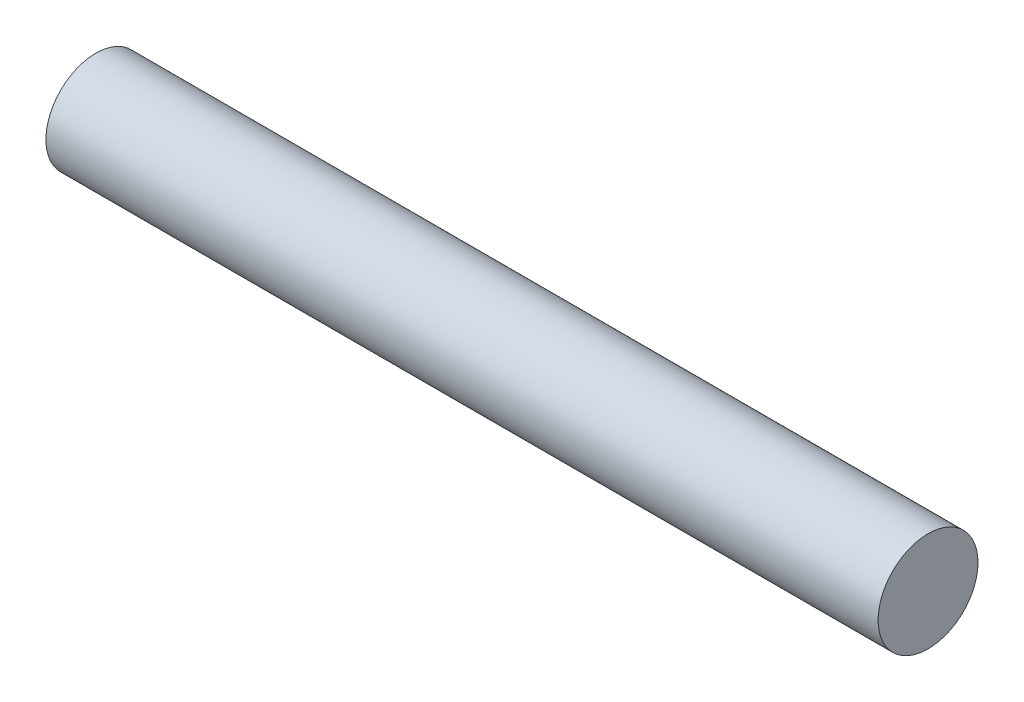
ISO-10303-21;
HEADER;
FILE_DESCRIPTION(('STEP AP214'),'2;1');
FILE_NAME('part.step','',(''),(''),'','','');
FILE_SCHEMA(('AUTOMOTIVE_DESIGN { 1 0 10303 214 1 1 1 1 }'));
ENDSEC;
DATA;
#1=APPLICATION_CONTEXT('core data for automotive mechanical design processes');
#2=APPLICATION_PROTOCOL_DEFINITION('international standard','automotive_design',2000,#1);
#3=PRODUCT_CONTEXT('',#1,'mechanical');
#4=PRODUCT('Part','Part','',(#3));
#5=PRODUCT_RELATED_PRODUCT_CATEGORY('part','',(#4));
#6=PRODUCT_DEFINITION_FORMATION('','',#4);
#7=PRODUCT_DEFINITION_CONTEXT('part definition',#1,'design');
#8=PRODUCT_DEFINITION('design','',#6,#7);
#9=PRODUCT_DEFINITION_SHAPE('','',#8);
#10=(LENGTH_UNIT() NAMED_UNIT(*) SI_UNIT(.MILLI.,.METRE.));
#11=(NAMED_UNIT(*) PLANE_ANGLE_UNIT() SI_UNIT($,.RADIAN.));
#12=(NAMED_UNIT(*) SI_UNIT($,.STERADIAN.) SOLID_ANGLE_UNIT());
#13=UNCERTAINTY_MEASURE_WITH_UNIT(LENGTH_MEASURE(1.E-05),#10,'distance_accuracy_value','');
#14=(GEOMETRIC_REPRESENTATION_CONTEXT(3) GLOBAL_UNCERTAINTY_ASSIGNED_CONTEXT((#13)) GLOBAL_UNIT_ASSIGNED_CONTEXT((#10,
#11,#12)) REPRESENTATION_CONTEXT('',''));
#15=CARTESIAN_POINT('',(0.,0.,0.));
#16=DIRECTION('',(0.,0.,1.));
#17=DIRECTION('',(1.,0.,0.));
#18=AXIS2_PLACEMENT_3D('',#15,#16,#17);
#19=CARTESIAN_POINT('',(50.,0.,0.));
#20=DIRECTION('',(-1.,0.,0.));
#21=DIRECTION('',(0.,0.,1.));
#22=AXIS2_PLACEMENT_3D('',#19,#20,#21);
#23=CYLINDRICAL_SURFACE('',#22,3.);
#24=CARTESIAN_POINT('',(50.,0.,0.));
#25=DIRECTION('',(1.,0.,0.));
#26=DIRECTION('',(0.,0.,-1.));
#27=AXIS2_PLACEMENT_3D('',#24,#25,#26);
#28=CIRCLE('',#27,3.);
#29=CARTESIAN_POINT('',(50.,0.,-3.));
#30=VERTEX_POINT('',#29);
#31=EDGE_CURVE('E10',#30,#30,#28,.T.);
#32=ORIENTED_EDGE('',*,*,#31,.F.);
#33=EDGE_LOOP('',(#32));
#34=FACE_BOUND('',#33,.T.);
#35=CARTESIAN_POINT('',(0.,0.,0.));
#36=DIRECTION('',(1.,0.,0.));
#37=DIRECTION('',(0.,0.,-1.));
#38=AXIS2_PLACEMENT_3D('',#35,#36,#37);
#39=CIRCLE('',#38,3.);
#40=CARTESIAN_POINT('',(0.,0.,-3.));
#41=VERTEX_POINT('',#40);
#42=EDGE_CURVE('E40',#41,#41,#39,.T.);
#43=ORIENTED_EDGE('',*,*,#42,.T.);
#44=EDGE_LOOP('',(#43));
#45=FACE_BOUND('',#44,.T.);
#46=ADVANCED_FACE('F37',(#34,#45),#23,.T.);
#47=CARTESIAN_POINT('',(50.,0.,0.));
#48=DIRECTION('',(1.,0.,0.));
#49=DIRECTION('',(0.,0.,-1.));
#50=AXIS2_PLACEMENT_3D('',#47,#48,#49);
#51=PLANE('',#50);
#52=ORIENTED_EDGE('',*,*,#31,.T.);
#53=EDGE_LOOP('',(#52));
#54=FACE_BOUND('',#53,.T.);
#55=ADVANCED_FACE('F52',(#54),#51,.T.);
#56=CARTESIAN_POINT('',(0.,0.,0.));
#57=DIRECTION('',(1.,0.,0.));
#58=DIRECTION('',(0.,0.,-1.));
#59=AXIS2_PLACEMENT_3D('',#56,#57,#58);
#60=PLANE('',#59);
#61=ORIENTED_EDGE('',*,*,#42,.F.);
#62=EDGE_LOOP('',(#61));
#63=FACE_BOUND('',#62,.T.);
#64=ADVANCED_FACE('F50',(#63),#60,.F.);
#65=CLOSED_SHELL('',(#46,#55,#64));
#66=MANIFOLD_SOLID_BREP('B2',#65);
#67=ADVANCED_BREP_SHAPE_REPRESENTATION('',(#18,#66),#14);
#68=SHAPE_DEFINITION_REPRESENTATION(#9,#67);
ENDSEC;
END-ISO-10303-21;
